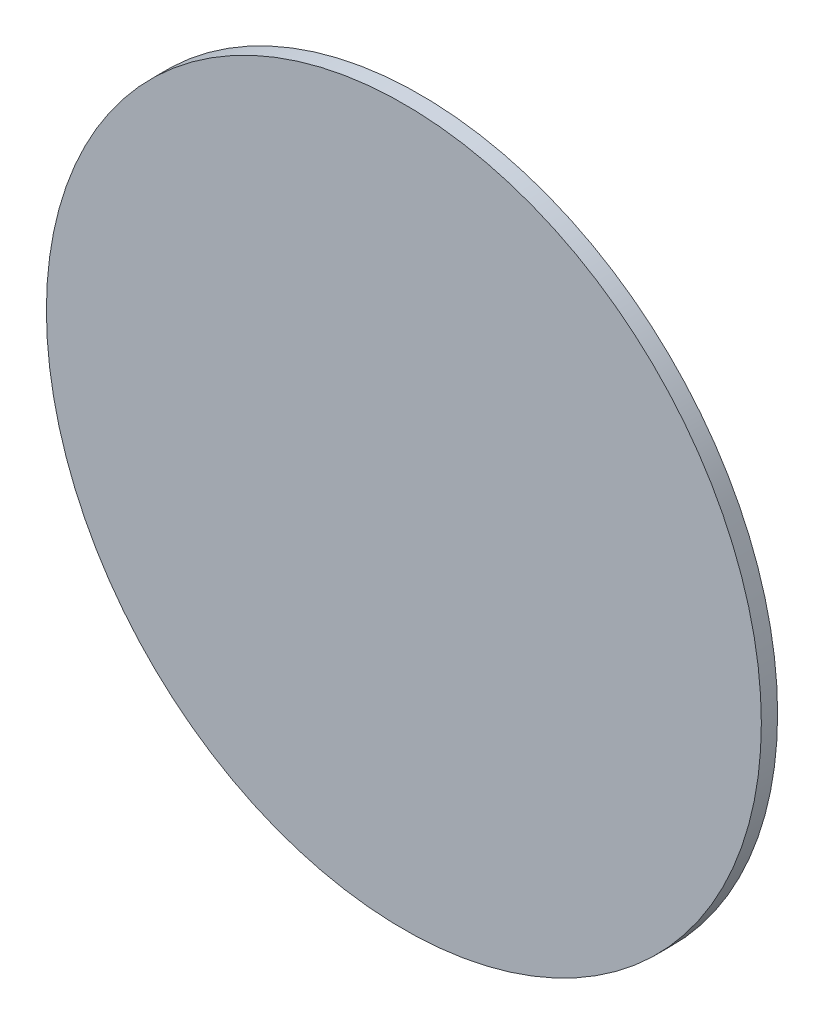
ISO-10303-21;
HEADER;
FILE_DESCRIPTION(('STEP AP214'),'2;1');
FILE_NAME('part.step','',(''),(''),'','','');
FILE_SCHEMA(('AUTOMOTIVE_DESIGN { 1 0 10303 214 1 1 1 1 }'));
ENDSEC;
DATA;
#1=APPLICATION_CONTEXT('core data for automotive mechanical design processes');
#2=APPLICATION_PROTOCOL_DEFINITION('international standard','automotive_design',2000,#1);
#3=PRODUCT_CONTEXT('',#1,'mechanical');
#4=PRODUCT('Part','Part','',(#3));
#5=PRODUCT_RELATED_PRODUCT_CATEGORY('part','',(#4));
#6=PRODUCT_DEFINITION_FORMATION('','',#4);
#7=PRODUCT_DEFINITION_CONTEXT('part definition',#1,'design');
#8=PRODUCT_DEFINITION('design','',#6,#7);
#9=PRODUCT_DEFINITION_SHAPE('','',#8);
#10=(LENGTH_UNIT() NAMED_UNIT(*) SI_UNIT(.MILLI.,.METRE.));
#11=(NAMED_UNIT(*) PLANE_ANGLE_UNIT() SI_UNIT($,.RADIAN.));
#12=(NAMED_UNIT(*) SI_UNIT($,.STERADIAN.) SOLID_ANGLE_UNIT());
#13=UNCERTAINTY_MEASURE_WITH_UNIT(LENGTH_MEASURE(1.E-05),#10,'distance_accuracy_value','');
#14=(GEOMETRIC_REPRESENTATION_CONTEXT(3) GLOBAL_UNCERTAINTY_ASSIGNED_CONTEXT((#13)) GLOBAL_UNIT_ASSIGNED_CONTEXT((#10,
#11,#12)) REPRESENTATION_CONTEXT('',''));
#15=CARTESIAN_POINT('',(0.,0.,0.));
#16=DIRECTION('',(0.,0.,1.));
#17=DIRECTION('',(1.,0.,0.));
#18=AXIS2_PLACEMENT_3D('',#15,#16,#17);
#19=CARTESIAN_POINT('',(0.,0.,5.));
#20=DIRECTION('',(0.,0.,-1.));
#21=DIRECTION('',(-1.,0.,0.));
#22=AXIS2_PLACEMENT_3D('',#19,#20,#21);
#23=CYLINDRICAL_SURFACE('',#22,110.);
#24=CARTESIAN_POINT('',(0.,0.,5.));
#25=DIRECTION('',(0.,0.,1.));
#26=DIRECTION('',(1.,0.,0.));
#27=AXIS2_PLACEMENT_3D('',#24,#25,#26);
#28=CIRCLE('',#27,110.);
#29=CARTESIAN_POINT('',(110.,0.,5.));
#30=VERTEX_POINT('',#29);
#31=EDGE_CURVE('E10',#30,#30,#28,.T.);
#32=ORIENTED_EDGE('',*,*,#31,.F.);
#33=EDGE_LOOP('',(#32));
#34=FACE_BOUND('',#33,.T.);
#35=CARTESIAN_POINT('',(0.,0.,0.));
#36=DIRECTION('',(0.,0.,1.));
#37=DIRECTION('',(1.,0.,0.));
#38=AXIS2_PLACEMENT_3D('',#35,#36,#37);
#39=CIRCLE('',#38,110.);
#40=CARTESIAN_POINT('',(110.,0.,0.));
#41=VERTEX_POINT('',#40);
#42=EDGE_CURVE('E35',#41,#41,#39,.T.);
#43=ORIENTED_EDGE('',*,*,#42,.T.);
#44=EDGE_LOOP('',(#43));
#45=FACE_BOUND('',#44,.T.);
#46=ADVANCED_FACE('F32',(#34,#45),#23,.T.);
#47=CARTESIAN_POINT('',(0.,0.,5.));
#48=DIRECTION('',(0.,0.,1.));
#49=DIRECTION('',(1.,0.,0.));
#50=AXIS2_PLACEMENT_3D('',#47,#48,#49);
#51=PLANE('',#50);
#52=ORIENTED_EDGE('',*,*,#31,.T.);
#53=EDGE_LOOP('',(#52));
#54=FACE_BOUND('',#53,.T.);
#55=ADVANCED_FACE('F47',(#54),#51,.T.);
#56=CARTESIAN_POINT('',(0.,0.,0.));
#57=DIRECTION('',(0.,0.,1.));
#58=DIRECTION('',(1.,0.,0.));
#59=AXIS2_PLACEMENT_3D('',#56,#57,#58);
#60=PLANE('',#59);
#61=ORIENTED_EDGE('',*,*,#42,.F.);
#62=EDGE_LOOP('',(#61));
#63=FACE_BOUND('',#62,.T.);
#64=ADVANCED_FACE('F45',(#63),#60,.F.);
#65=CLOSED_SHELL('',(#46,#55,#64));
#66=MANIFOLD_SOLID_BREP('B2',#65);
#67=ADVANCED_BREP_SHAPE_REPRESENTATION('',(#18,#66),#14);
#68=SHAPE_DEFINITION_REPRESENTATION(#9,#67);
ENDSEC;
END-ISO-10303-21;
